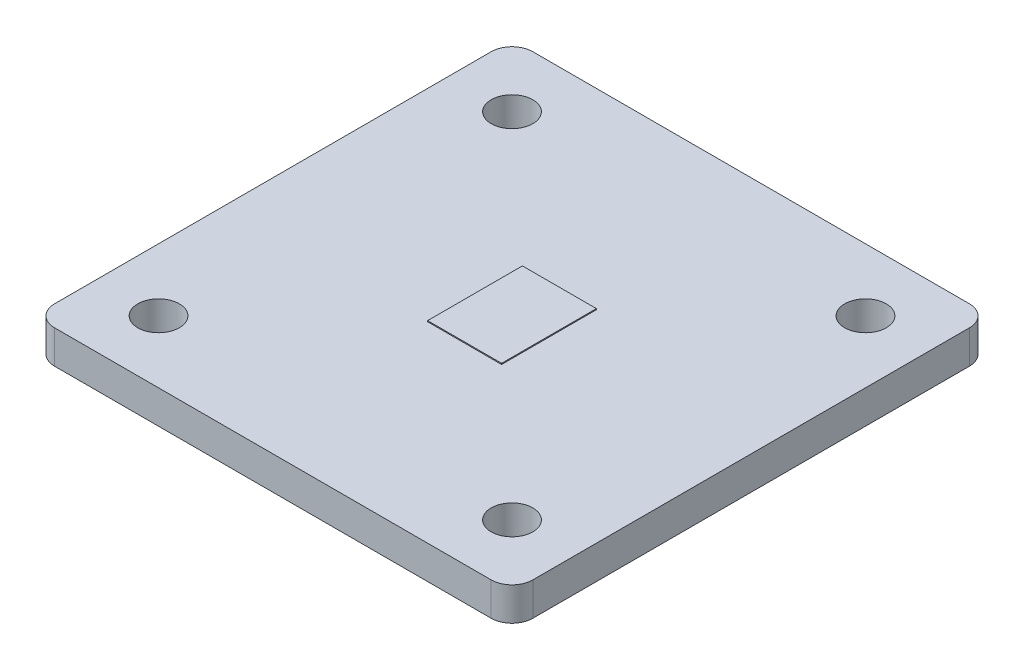
ISO-10303-21;
HEADER;
FILE_DESCRIPTION(('STEP AP214'),'2;1');
FILE_NAME('part.step','',(''),(''),'','','');
FILE_SCHEMA(('AUTOMOTIVE_DESIGN { 1 0 10303 214 1 1 1 1 }'));
ENDSEC;
DATA;
#1=APPLICATION_CONTEXT('core data for automotive mechanical design processes');
#2=APPLICATION_PROTOCOL_DEFINITION('international standard','automotive_design',2000,#1);
#3=PRODUCT_CONTEXT('',#1,'mechanical');
#4=PRODUCT('Part','Part','',(#3));
#5=PRODUCT_RELATED_PRODUCT_CATEGORY('part','',(#4));
#6=PRODUCT_DEFINITION_FORMATION('','',#4);
#7=PRODUCT_DEFINITION_CONTEXT('part definition',#1,'design');
#8=PRODUCT_DEFINITION('design','',#6,#7);
#9=PRODUCT_DEFINITION_SHAPE('','',#8);
#10=(LENGTH_UNIT() NAMED_UNIT(*) SI_UNIT(.MILLI.,.METRE.));
#11=(NAMED_UNIT(*) PLANE_ANGLE_UNIT() SI_UNIT($,.RADIAN.));
#12=(NAMED_UNIT(*) SI_UNIT($,.STERADIAN.) SOLID_ANGLE_UNIT());
#13=UNCERTAINTY_MEASURE_WITH_UNIT(LENGTH_MEASURE(1.E-05),#10,'distance_accuracy_value','');
#14=(GEOMETRIC_REPRESENTATION_CONTEXT(3) GLOBAL_UNCERTAINTY_ASSIGNED_CONTEXT((#13)) GLOBAL_UNIT_ASSIGNED_CONTEXT((#10,
#11,#12)) REPRESENTATION_CONTEXT('',''));
#15=CARTESIAN_POINT('',(0.,0.,0.));
#16=DIRECTION('',(0.,0.,1.));
#17=DIRECTION('',(1.,0.,0.));
#18=AXIS2_PLACEMENT_3D('',#15,#16,#17);
#19=CARTESIAN_POINT('',(10.5,1.6,10.5));
#20=DIRECTION('',(0.,1.,0.));
#21=DIRECTION('',(0.,0.,1.));
#22=AXIS2_PLACEMENT_3D('',#19,#20,#21);
#23=PLANE('',#22);
#24=CARTESIAN_POINT('',(-8.5,1.6,8.5));
#25=DIRECTION('',(0.,1.,0.));
#26=DIRECTION('',(0.,0.,-1.));
#27=AXIS2_PLACEMENT_3D('',#24,#25,#26);
#28=CIRCLE('',#27,1.00000000000001);
#29=CARTESIAN_POINT('',(-8.5,1.6,7.49999999999999));
#30=VERTEX_POINT('',#29);
#31=EDGE_CURVE('E237',#30,#30,#28,.T.);
#32=ORIENTED_EDGE('',*,*,#31,.F.);
#33=EDGE_LOOP('',(#32));
#34=FACE_BOUND('',#33,.T.);
#35=CARTESIAN_POINT('',(8.49999999999999,1.6,-8.5));
#36=DIRECTION('',(0.,1.,0.));
#37=DIRECTION('',(0.,0.,-1.));
#38=AXIS2_PLACEMENT_3D('',#35,#36,#37);
#39=CIRCLE('',#38,1.);
#40=CARTESIAN_POINT('',(8.49999999999999,1.6,-9.5));
#41=VERTEX_POINT('',#40);
#42=EDGE_CURVE('E245',#41,#41,#39,.T.);
#43=ORIENTED_EDGE('',*,*,#42,.F.);
#44=EDGE_LOOP('',(#43));
#45=FACE_BOUND('',#44,.T.);
#46=CARTESIAN_POINT('',(8.5,1.6,8.5));
#47=DIRECTION('',(0.,1.,0.));
#48=DIRECTION('',(0.,0.,1.));
#49=AXIS2_PLACEMENT_3D('',#46,#47,#48);
#50=CIRCLE('',#49,1.00000000000001);
#51=CARTESIAN_POINT('',(8.5,1.6,9.5));
#52=VERTEX_POINT('',#51);
#53=EDGE_CURVE('E246',#52,#52,#50,.T.);
#54=ORIENTED_EDGE('',*,*,#53,.F.);
#55=EDGE_LOOP('',(#54));
#56=FACE_BOUND('',#55,.T.);
#57=CARTESIAN_POINT('',(-8.5,1.6,-8.5));
#58=DIRECTION('',(0.,1.,0.));
#59=DIRECTION('',(0.,0.,1.));
#60=AXIS2_PLACEMENT_3D('',#57,#58,#59);
#61=CIRCLE('',#60,1.);
#62=CARTESIAN_POINT('',(-8.5,1.6,-7.5));
#63=VERTEX_POINT('',#62);
#64=EDGE_CURVE('E233',#63,#63,#61,.T.);
#65=ORIENTED_EDGE('',*,*,#64,.F.);
#66=EDGE_LOOP('',(#65));
#67=FACE_BOUND('',#66,.T.);
#68=CARTESIAN_POINT('',(10.5,1.6,10.5));
#69=DIRECTION('',(0.,1.,0.));
#70=DIRECTION('',(0.,0.,1.));
#71=AXIS2_PLACEMENT_3D('',#68,#69,#70);
#72=CIRCLE('',#71,0.999999999999999);
#73=CARTESIAN_POINT('',(10.5,1.6,11.5));
#74=VERTEX_POINT('',#73);
#75=CARTESIAN_POINT('',(11.5,1.6,10.5));
#76=VERTEX_POINT('',#75);
#77=EDGE_CURVE('E189',#74,#76,#72,.T.);
#78=ORIENTED_EDGE('',*,*,#77,.T.);
#79=DIRECTION('',(0.,0.,-1.));
#80=VECTOR('',#79,1.);
#81=CARTESIAN_POINT('',(11.5,1.6,10.5));
#82=LINE('',#81,#80);
#83=CARTESIAN_POINT('',(11.5,1.6,-10.5));
#84=VERTEX_POINT('',#83);
#85=EDGE_CURVE('E117',#76,#84,#82,.T.);
#86=ORIENTED_EDGE('',*,*,#85,.T.);
#87=CARTESIAN_POINT('',(10.5,1.6,-10.5));
#88=DIRECTION('',(0.,1.,0.));
#89=DIRECTION('',(0.,0.,-1.));
#90=AXIS2_PLACEMENT_3D('',#87,#88,#89);
#91=CIRCLE('',#90,0.999999999999999);
#92=CARTESIAN_POINT('',(10.5,1.6,-11.5));
#93=VERTEX_POINT('',#92);
#94=EDGE_CURVE('E210',#84,#93,#91,.T.);
#95=ORIENTED_EDGE('',*,*,#94,.T.);
#96=DIRECTION('',(-1.,0.,0.));
#97=VECTOR('',#96,1.);
#98=CARTESIAN_POINT('',(-10.5,1.6,-11.5));
#99=LINE('',#98,#97);
#100=CARTESIAN_POINT('',(-10.5,1.6,-11.5));
#101=VERTEX_POINT('',#100);
#102=EDGE_CURVE('E223',#93,#101,#99,.T.);
#103=ORIENTED_EDGE('',*,*,#102,.T.);
#104=CARTESIAN_POINT('',(-10.5,1.6,-10.5));
#105=DIRECTION('',(0.,1.,0.));
#106=DIRECTION('',(0.,0.,-1.));
#107=AXIS2_PLACEMENT_3D('',#104,#105,#106);
#108=CIRCLE('',#107,0.999999999999999);
#109=CARTESIAN_POINT('',(-11.5,1.6,-10.5));
#110=VERTEX_POINT('',#109);
#111=EDGE_CURVE('E140',#101,#110,#108,.T.);
#112=ORIENTED_EDGE('',*,*,#111,.T.);
#113=DIRECTION('',(0.,0.,1.));
#114=VECTOR('',#113,1.);
#115=CARTESIAN_POINT('',(-11.5,1.6,10.5));
#116=LINE('',#115,#114);
#117=CARTESIAN_POINT('',(-11.5,1.6,10.5));
#118=VERTEX_POINT('',#117);
#119=EDGE_CURVE('E133',#110,#118,#116,.T.);
#120=ORIENTED_EDGE('',*,*,#119,.T.);
#121=CARTESIAN_POINT('',(-10.5,1.6,10.5));
#122=DIRECTION('',(0.,1.,0.));
#123=DIRECTION('',(0.,0.,-1.));
#124=AXIS2_PLACEMENT_3D('',#121,#122,#123);
#125=CIRCLE('',#124,0.999999999999999);
#126=CARTESIAN_POINT('',(-10.5,1.6,11.5));
#127=VERTEX_POINT('',#126);
#128=EDGE_CURVE('E137',#118,#127,#125,.T.);
#129=ORIENTED_EDGE('',*,*,#128,.T.);
#130=DIRECTION('',(1.,0.,0.));
#131=VECTOR('',#130,1.);
#132=CARTESIAN_POINT('',(-10.5,1.6,11.5));
#133=LINE('',#132,#131);
#134=EDGE_CURVE('E76',#127,#74,#133,.T.);
#135=ORIENTED_EDGE('',*,*,#134,.T.);
#136=EDGE_LOOP('',(#78,#86,#95,#103,#112,#120,#129,#135));
#137=FACE_BOUND('',#136,.T.);
#138=DIRECTION('',(-1.,0.,0.));
#139=VECTOR('',#138,1.);
#140=CARTESIAN_POINT('',(-1.7785,1.6,-2.2785));
#141=LINE('',#140,#139);
#142=CARTESIAN_POINT('',(1.7785,1.6,-2.2785));
#143=VERTEX_POINT('',#142);
#144=CARTESIAN_POINT('',(-1.7785,1.6,-2.2785));
#145=VERTEX_POINT('',#144);
#146=EDGE_CURVE('E286',#143,#145,#141,.T.);
#147=ORIENTED_EDGE('',*,*,#146,.F.);
#148=DIRECTION('',(0.,0.,-1.));
#149=VECTOR('',#148,1.);
#150=CARTESIAN_POINT('',(1.7785,1.6,2.2785));
#151=LINE('',#150,#149);
#152=CARTESIAN_POINT('',(1.7785,1.6,2.2785));
#153=VERTEX_POINT('',#152);
#154=EDGE_CURVE('E290',#153,#143,#151,.T.);
#155=ORIENTED_EDGE('',*,*,#154,.F.);
#156=DIRECTION('',(1.,0.,0.));
#157=VECTOR('',#156,1.);
#158=CARTESIAN_POINT('',(-1.7785,1.6,2.2785));
#159=LINE('',#158,#157);
#160=CARTESIAN_POINT('',(-1.7785,1.6,2.2785));
#161=VERTEX_POINT('',#160);
#162=EDGE_CURVE('E279',#161,#153,#159,.T.);
#163=ORIENTED_EDGE('',*,*,#162,.F.);
#164=DIRECTION('',(0.,0.,1.));
#165=VECTOR('',#164,1.);
#166=CARTESIAN_POINT('',(-1.7785,1.6,2.2785));
#167=LINE('',#166,#165);
#168=EDGE_CURVE('E283',#145,#161,#167,.T.);
#169=ORIENTED_EDGE('',*,*,#168,.F.);
#170=EDGE_LOOP('',(#147,#155,#163,#169));
#171=FACE_BOUND('',#170,.T.);
#172=ADVANCED_FACE('F51',(#34,#45,#56,#67,#137,#171),#23,.T.);
#173=CARTESIAN_POINT('',(10.5,1.6,10.5));
#174=DIRECTION('',(0.,-1.,0.));
#175=DIRECTION('',(0.,0.,-1.));
#176=AXIS2_PLACEMENT_3D('',#173,#174,#175);
#177=CYLINDRICAL_SURFACE('',#176,0.999999999999999);
#178=CARTESIAN_POINT('',(10.5,0.,10.5));
#179=DIRECTION('',(0.,1.,0.));
#180=DIRECTION('',(0.,0.,1.));
#181=AXIS2_PLACEMENT_3D('',#178,#179,#180);
#182=CIRCLE('',#181,0.999999999999999);
#183=CARTESIAN_POINT('',(10.5,0.,11.5));
#184=VERTEX_POINT('',#183);
#185=CARTESIAN_POINT('',(11.5,0.,10.5));
#186=VERTEX_POINT('',#185);
#187=EDGE_CURVE('E165',#184,#186,#182,.T.);
#188=ORIENTED_EDGE('',*,*,#187,.T.);
#189=DIRECTION('',(0.,-1.,0.));
#190=VECTOR('',#189,1.);
#191=CARTESIAN_POINT('',(11.5,1.6,10.5));
#192=LINE('',#191,#190);
#193=EDGE_CURVE('E11',#76,#186,#192,.T.);
#194=ORIENTED_EDGE('',*,*,#193,.F.);
#195=ORIENTED_EDGE('',*,*,#77,.F.);
#196=DIRECTION('',(0.,-1.,0.));
#197=VECTOR('',#196,1.);
#198=CARTESIAN_POINT('',(10.5,1.6,11.5));
#199=LINE('',#198,#197);
#200=EDGE_CURVE('E161',#74,#184,#199,.T.);
#201=ORIENTED_EDGE('',*,*,#200,.T.);
#202=EDGE_LOOP('',(#188,#194,#195,#201));
#203=FACE_BOUND('',#202,.T.);
#204=ADVANCED_FACE('F53',(#203),#177,.T.);
#205=CARTESIAN_POINT('',(11.5,1.6,10.5));
#206=DIRECTION('',(-1.,0.,0.));
#207=DIRECTION('',(0.,0.,1.));
#208=AXIS2_PLACEMENT_3D('',#205,#206,#207);
#209=PLANE('',#208);
#210=DIRECTION('',(0.,0.,-1.));
#211=VECTOR('',#210,1.);
#212=CARTESIAN_POINT('',(11.5,0.,10.5));
#213=LINE('',#212,#211);
#214=CARTESIAN_POINT('',(11.5,0.,-10.5));
#215=VERTEX_POINT('',#214);
#216=EDGE_CURVE('E169',#186,#215,#213,.T.);
#217=ORIENTED_EDGE('',*,*,#216,.T.);
#218=DIRECTION('',(0.,-1.,0.));
#219=VECTOR('',#218,1.);
#220=CARTESIAN_POINT('',(11.5,1.6,-10.5));
#221=LINE('',#220,#219);
#222=EDGE_CURVE('E60',#84,#215,#221,.T.);
#223=ORIENTED_EDGE('',*,*,#222,.F.);
#224=ORIENTED_EDGE('',*,*,#85,.F.);
#225=ORIENTED_EDGE('',*,*,#193,.T.);
#226=EDGE_LOOP('',(#217,#223,#224,#225));
#227=FACE_BOUND('',#226,.T.);
#228=ADVANCED_FACE('F344',(#227),#209,.F.);
#229=CARTESIAN_POINT('',(10.5,1.6,-10.5));
#230=DIRECTION('',(0.,-1.,0.));
#231=DIRECTION('',(0.,0.,-1.));
#232=AXIS2_PLACEMENT_3D('',#229,#230,#231);
#233=CYLINDRICAL_SURFACE('',#232,0.999999999999999);
#234=CARTESIAN_POINT('',(10.5,0.,-10.5));
#235=DIRECTION('',(0.,1.,0.));
#236=DIRECTION('',(0.,0.,-1.));
#237=AXIS2_PLACEMENT_3D('',#234,#235,#236);
#238=CIRCLE('',#237,0.999999999999999);
#239=CARTESIAN_POINT('',(10.5,0.,-11.5));
#240=VERTEX_POINT('',#239);
#241=EDGE_CURVE('E173',#215,#240,#238,.T.);
#242=ORIENTED_EDGE('',*,*,#241,.T.);
#243=DIRECTION('',(0.,-1.,0.));
#244=VECTOR('',#243,1.);
#245=CARTESIAN_POINT('',(10.5,1.6,-11.5));
#246=LINE('',#245,#244);
#247=EDGE_CURVE('E200',#93,#240,#246,.T.);
#248=ORIENTED_EDGE('',*,*,#247,.F.);
#249=ORIENTED_EDGE('',*,*,#94,.F.);
#250=ORIENTED_EDGE('',*,*,#222,.T.);
#251=EDGE_LOOP('',(#242,#248,#249,#250));
#252=FACE_BOUND('',#251,.T.);
#253=ADVANCED_FACE('F208',(#252),#233,.T.);
#254=CARTESIAN_POINT('',(-10.5,1.6,-11.5));
#255=DIRECTION('',(0.,0.,1.));
#256=DIRECTION('',(1.,0.,0.));
#257=AXIS2_PLACEMENT_3D('',#254,#255,#256);
#258=PLANE('',#257);
#259=DIRECTION('',(-1.,0.,0.));
#260=VECTOR('',#259,1.);
#261=CARTESIAN_POINT('',(-10.5,0.,-11.5));
#262=LINE('',#261,#260);
#263=CARTESIAN_POINT('',(-10.5,0.,-11.5));
#264=VERTEX_POINT('',#263);
#265=EDGE_CURVE('E176',#240,#264,#262,.T.);
#266=ORIENTED_EDGE('',*,*,#265,.T.);
#267=DIRECTION('',(0.,-1.,0.));
#268=VECTOR('',#267,1.);
#269=CARTESIAN_POINT('',(-10.5,1.6,-11.5));
#270=LINE('',#269,#268);
#271=EDGE_CURVE('E196',#101,#264,#270,.T.);
#272=ORIENTED_EDGE('',*,*,#271,.F.);
#273=ORIENTED_EDGE('',*,*,#102,.F.);
#274=ORIENTED_EDGE('',*,*,#247,.T.);
#275=EDGE_LOOP('',(#266,#272,#273,#274));
#276=FACE_BOUND('',#275,.T.);
#277=ADVANCED_FACE('F218',(#276),#258,.F.);
#278=CARTESIAN_POINT('',(-10.5,1.6,-10.5));
#279=DIRECTION('',(0.,-1.,0.));
#280=DIRECTION('',(0.,0.,-1.));
#281=AXIS2_PLACEMENT_3D('',#278,#279,#280);
#282=CYLINDRICAL_SURFACE('',#281,0.999999999999999);
#283=CARTESIAN_POINT('',(-10.5,0.,-10.5));
#284=DIRECTION('',(0.,1.,0.));
#285=DIRECTION('',(0.,0.,-1.));
#286=AXIS2_PLACEMENT_3D('',#283,#284,#285);
#287=CIRCLE('',#286,0.999999999999999);
#288=CARTESIAN_POINT('',(-11.5,0.,-10.5));
#289=VERTEX_POINT('',#288);
#290=EDGE_CURVE('E179',#264,#289,#287,.T.);
#291=ORIENTED_EDGE('',*,*,#290,.T.);
#292=DIRECTION('',(0.,-1.,0.));
#293=VECTOR('',#292,1.);
#294=CARTESIAN_POINT('',(-11.5,1.6,-10.5));
#295=LINE('',#294,#293);
#296=EDGE_CURVE('E154',#110,#289,#295,.T.);
#297=ORIENTED_EDGE('',*,*,#296,.F.);
#298=ORIENTED_EDGE('',*,*,#111,.F.);
#299=ORIENTED_EDGE('',*,*,#271,.T.);
#300=EDGE_LOOP('',(#291,#297,#298,#299));
#301=FACE_BOUND('',#300,.T.);
#302=ADVANCED_FACE('F221',(#301),#282,.T.);
#303=CARTESIAN_POINT('',(-11.5,1.6,10.5));
#304=DIRECTION('',(1.,0.,0.));
#305=DIRECTION('',(0.,0.,-1.));
#306=AXIS2_PLACEMENT_3D('',#303,#304,#305);
#307=PLANE('',#306);
#308=DIRECTION('',(0.,0.,1.));
#309=VECTOR('',#308,1.);
#310=CARTESIAN_POINT('',(-11.5,0.,10.5));
#311=LINE('',#310,#309);
#312=CARTESIAN_POINT('',(-11.5,0.,10.5));
#313=VERTEX_POINT('',#312);
#314=EDGE_CURVE('E150',#289,#313,#311,.T.);
#315=ORIENTED_EDGE('',*,*,#314,.T.);
#316=DIRECTION('',(0.,-1.,0.));
#317=VECTOR('',#316,1.);
#318=CARTESIAN_POINT('',(-11.5,1.6,10.5));
#319=LINE('',#318,#317);
#320=EDGE_CURVE('E147',#118,#313,#319,.T.);
#321=ORIENTED_EDGE('',*,*,#320,.F.);
#322=ORIENTED_EDGE('',*,*,#119,.F.);
#323=ORIENTED_EDGE('',*,*,#296,.T.);
#324=EDGE_LOOP('',(#315,#321,#322,#323));
#325=FACE_BOUND('',#324,.T.);
#326=ADVANCED_FACE('F148',(#325),#307,.F.);
#327=CARTESIAN_POINT('',(-10.5,1.6,10.5));
#328=DIRECTION('',(0.,-1.,0.));
#329=DIRECTION('',(0.,0.,-1.));
#330=AXIS2_PLACEMENT_3D('',#327,#328,#329);
#331=CYLINDRICAL_SURFACE('',#330,0.999999999999999);
#332=CARTESIAN_POINT('',(-10.5,0.,10.5));
#333=DIRECTION('',(0.,1.,0.));
#334=DIRECTION('',(0.,0.,-1.));
#335=AXIS2_PLACEMENT_3D('',#332,#333,#334);
#336=CIRCLE('',#335,0.999999999999999);
#337=CARTESIAN_POINT('',(-10.5,0.,11.5));
#338=VERTEX_POINT('',#337);
#339=EDGE_CURVE('E184',#313,#338,#336,.T.);
#340=ORIENTED_EDGE('',*,*,#339,.T.);
#341=DIRECTION('',(0.,-1.,0.));
#342=VECTOR('',#341,1.);
#343=CARTESIAN_POINT('',(-10.5,1.6,11.5));
#344=LINE('',#343,#342);
#345=EDGE_CURVE('E155',#127,#338,#344,.T.);
#346=ORIENTED_EDGE('',*,*,#345,.F.);
#347=ORIENTED_EDGE('',*,*,#128,.F.);
#348=ORIENTED_EDGE('',*,*,#320,.T.);
#349=EDGE_LOOP('',(#340,#346,#347,#348));
#350=FACE_BOUND('',#349,.T.);
#351=ADVANCED_FACE('F157',(#350),#331,.T.);
#352=CARTESIAN_POINT('',(-10.5,1.6,11.5));
#353=DIRECTION('',(0.,0.,-1.));
#354=DIRECTION('',(-1.,0.,0.));
#355=AXIS2_PLACEMENT_3D('',#352,#353,#354);
#356=PLANE('',#355);
#357=DIRECTION('',(1.,0.,0.));
#358=VECTOR('',#357,1.);
#359=CARTESIAN_POINT('',(-10.5,0.,11.5));
#360=LINE('',#359,#358);
#361=EDGE_CURVE('E109',#338,#184,#360,.T.);
#362=ORIENTED_EDGE('',*,*,#361,.T.);
#363=ORIENTED_EDGE('',*,*,#200,.F.);
#364=ORIENTED_EDGE('',*,*,#134,.F.);
#365=ORIENTED_EDGE('',*,*,#345,.T.);
#366=EDGE_LOOP('',(#362,#363,#364,#365));
#367=FACE_BOUND('',#366,.T.);
#368=ADVANCED_FACE('F354',(#367),#356,.F.);
#369=CARTESIAN_POINT('',(10.5,0.,10.5));
#370=DIRECTION('',(0.,1.,0.));
#371=DIRECTION('',(0.,0.,1.));
#372=AXIS2_PLACEMENT_3D('',#369,#370,#371);
#373=PLANE('',#372);
#374=CARTESIAN_POINT('',(-8.5,0.,8.5));
#375=DIRECTION('',(0.,1.,0.));
#376=DIRECTION('',(0.,0.,-1.));
#377=AXIS2_PLACEMENT_3D('',#374,#375,#376);
#378=CIRCLE('',#377,1.00000000000001);
#379=CARTESIAN_POINT('',(-8.5,0.,7.49999999999999));
#380=VERTEX_POINT('',#379);
#381=EDGE_CURVE('E250',#380,#380,#378,.T.);
#382=ORIENTED_EDGE('',*,*,#381,.T.);
#383=EDGE_LOOP('',(#382));
#384=FACE_BOUND('',#383,.T.);
#385=CARTESIAN_POINT('',(8.49999999999999,0.,-8.5));
#386=DIRECTION('',(0.,1.,0.));
#387=DIRECTION('',(0.,0.,-1.));
#388=AXIS2_PLACEMENT_3D('',#385,#386,#387);
#389=CIRCLE('',#388,1.);
#390=CARTESIAN_POINT('',(8.49999999999999,0.,-9.5));
#391=VERTEX_POINT('',#390);
#392=EDGE_CURVE('E241',#391,#391,#389,.T.);
#393=ORIENTED_EDGE('',*,*,#392,.T.);
#394=EDGE_LOOP('',(#393));
#395=FACE_BOUND('',#394,.T.);
#396=CARTESIAN_POINT('',(8.5,0.,8.5));
#397=DIRECTION('',(0.,1.,0.));
#398=DIRECTION('',(0.,0.,1.));
#399=AXIS2_PLACEMENT_3D('',#396,#397,#398);
#400=CIRCLE('',#399,1.00000000000001);
#401=CARTESIAN_POINT('',(8.5,0.,9.5));
#402=VERTEX_POINT('',#401);
#403=EDGE_CURVE('E257',#402,#402,#400,.T.);
#404=ORIENTED_EDGE('',*,*,#403,.T.);
#405=EDGE_LOOP('',(#404));
#406=FACE_BOUND('',#405,.T.);
#407=CARTESIAN_POINT('',(-8.5,0.,-8.5));
#408=DIRECTION('',(0.,1.,0.));
#409=DIRECTION('',(0.,0.,1.));
#410=AXIS2_PLACEMENT_3D('',#407,#408,#409);
#411=CIRCLE('',#410,1.);
#412=CARTESIAN_POINT('',(-8.5,0.,-7.5));
#413=VERTEX_POINT('',#412);
#414=EDGE_CURVE('E170',#413,#413,#411,.T.);
#415=ORIENTED_EDGE('',*,*,#414,.T.);
#416=EDGE_LOOP('',(#415));
#417=FACE_BOUND('',#416,.T.);
#418=ORIENTED_EDGE('',*,*,#187,.F.);
#419=ORIENTED_EDGE('',*,*,#361,.F.);
#420=ORIENTED_EDGE('',*,*,#339,.F.);
#421=ORIENTED_EDGE('',*,*,#314,.F.);
#422=ORIENTED_EDGE('',*,*,#290,.F.);
#423=ORIENTED_EDGE('',*,*,#265,.F.);
#424=ORIENTED_EDGE('',*,*,#241,.F.);
#425=ORIENTED_EDGE('',*,*,#216,.F.);
#426=EDGE_LOOP('',(#418,#419,#420,#421,#422,#423,#424,#425));
#427=FACE_BOUND('',#426,.T.);
#428=ADVANCED_FACE('F214',(#384,#395,#406,#417,#427),#373,.F.);
#429=CARTESIAN_POINT('',(-8.5,0.,-8.5));
#430=DIRECTION('',(0.,1.,0.));
#431=DIRECTION('',(0.,0.,1.));
#432=AXIS2_PLACEMENT_3D('',#429,#430,#431);
#433=CYLINDRICAL_SURFACE('',#432,1.);
#434=ORIENTED_EDGE('',*,*,#414,.F.);
#435=EDGE_LOOP('',(#434));
#436=FACE_BOUND('',#435,.T.);
#437=ORIENTED_EDGE('',*,*,#64,.T.);
#438=EDGE_LOOP('',(#437));
#439=FACE_BOUND('',#438,.T.);
#440=ADVANCED_FACE('F350',(#436,#439),#433,.F.);
#441=CARTESIAN_POINT('',(8.5,0.,8.5));
#442=DIRECTION('',(0.,1.,0.));
#443=DIRECTION('',(0.,0.,1.));
#444=AXIS2_PLACEMENT_3D('',#441,#442,#443);
#445=CYLINDRICAL_SURFACE('',#444,1.00000000000001);
#446=ORIENTED_EDGE('',*,*,#403,.F.);
#447=EDGE_LOOP('',(#446));
#448=FACE_BOUND('',#447,.T.);
#449=ORIENTED_EDGE('',*,*,#53,.T.);
#450=EDGE_LOOP('',(#449));
#451=FACE_BOUND('',#450,.T.);
#452=ADVANCED_FACE('F404',(#448,#451),#445,.F.);
#453=CARTESIAN_POINT('',(8.49999999999999,0.,-8.5));
#454=DIRECTION('',(0.,1.,0.));
#455=DIRECTION('',(0.,0.,1.));
#456=AXIS2_PLACEMENT_3D('',#453,#454,#455);
#457=CYLINDRICAL_SURFACE('',#456,1.);
#458=ORIENTED_EDGE('',*,*,#392,.F.);
#459=EDGE_LOOP('',(#458));
#460=FACE_BOUND('',#459,.T.);
#461=ORIENTED_EDGE('',*,*,#42,.T.);
#462=EDGE_LOOP('',(#461));
#463=FACE_BOUND('',#462,.T.);
#464=ADVANCED_FACE('F411',(#460,#463),#457,.F.);
#465=CARTESIAN_POINT('',(-8.5,0.,8.5));
#466=DIRECTION('',(0.,1.,0.));
#467=DIRECTION('',(0.,0.,1.));
#468=AXIS2_PLACEMENT_3D('',#465,#466,#467);
#469=CYLINDRICAL_SURFACE('',#468,1.00000000000001);
#470=ORIENTED_EDGE('',*,*,#381,.F.);
#471=EDGE_LOOP('',(#470));
#472=FACE_BOUND('',#471,.T.);
#473=ORIENTED_EDGE('',*,*,#31,.T.);
#474=EDGE_LOOP('',(#473));
#475=FACE_BOUND('',#474,.T.);
#476=ADVANCED_FACE('F419',(#472,#475),#469,.F.);
#477=CARTESIAN_POINT('',(1.7785,1.65,2.2785));
#478=DIRECTION('',(-1.,0.,0.));
#479=DIRECTION('',(0.,0.,1.));
#480=AXIS2_PLACEMENT_3D('',#477,#478,#479);
#481=PLANE('',#480);
#482=ORIENTED_EDGE('',*,*,#154,.T.);
#483=DIRECTION('',(0.,-1.,0.));
#484=VECTOR('',#483,1.);
#485=CARTESIAN_POINT('',(1.7785,1.65,-2.2785));
#486=LINE('',#485,#484);
#487=CARTESIAN_POINT('',(1.7785,1.65,-2.2785));
#488=VERTEX_POINT('',#487);
#489=EDGE_CURVE('E261',#488,#143,#486,.T.);
#490=ORIENTED_EDGE('',*,*,#489,.F.);
#491=DIRECTION('',(0.,0.,-1.));
#492=VECTOR('',#491,1.);
#493=CARTESIAN_POINT('',(1.7785,1.65,2.2785));
#494=LINE('',#493,#492);
#495=CARTESIAN_POINT('',(1.7785,1.65,2.2785));
#496=VERTEX_POINT('',#495);
#497=EDGE_CURVE('E282',#496,#488,#494,.T.);
#498=ORIENTED_EDGE('',*,*,#497,.F.);
#499=DIRECTION('',(0.,-1.,0.));
#500=VECTOR('',#499,1.);
#501=CARTESIAN_POINT('',(1.7785,1.65,2.2785));
#502=LINE('',#501,#500);
#503=EDGE_CURVE('E274',#496,#153,#502,.T.);
#504=ORIENTED_EDGE('',*,*,#503,.T.);
#505=EDGE_LOOP('',(#482,#490,#498,#504));
#506=FACE_BOUND('',#505,.T.);
#507=ADVANCED_FACE('F318',(#506),#481,.F.);
#508=CARTESIAN_POINT('',(-1.7785,1.65,-2.2785));
#509=DIRECTION('',(0.,0.,1.));
#510=DIRECTION('',(1.,0.,0.));
#511=AXIS2_PLACEMENT_3D('',#508,#509,#510);
#512=PLANE('',#511);
#513=ORIENTED_EDGE('',*,*,#146,.T.);
#514=DIRECTION('',(0.,-1.,0.));
#515=VECTOR('',#514,1.);
#516=CARTESIAN_POINT('',(-1.7785,1.65,-2.2785));
#517=LINE('',#516,#515);
#518=CARTESIAN_POINT('',(-1.7785,1.65,-2.2785));
#519=VERTEX_POINT('',#518);
#520=EDGE_CURVE('E268',#519,#145,#517,.T.);
#521=ORIENTED_EDGE('',*,*,#520,.F.);
#522=DIRECTION('',(-1.,0.,0.));
#523=VECTOR('',#522,1.);
#524=CARTESIAN_POINT('',(-1.7785,1.65,-2.2785));
#525=LINE('',#524,#523);
#526=EDGE_CURVE('E301',#488,#519,#525,.T.);
#527=ORIENTED_EDGE('',*,*,#526,.F.);
#528=ORIENTED_EDGE('',*,*,#489,.T.);
#529=EDGE_LOOP('',(#513,#521,#527,#528));
#530=FACE_BOUND('',#529,.T.);
#531=ADVANCED_FACE('F323',(#530),#512,.F.);
#532=CARTESIAN_POINT('',(-1.7785,1.65,2.2785));
#533=DIRECTION('',(1.,0.,0.));
#534=DIRECTION('',(0.,0.,-1.));
#535=AXIS2_PLACEMENT_3D('',#532,#533,#534);
#536=PLANE('',#535);
#537=ORIENTED_EDGE('',*,*,#168,.T.);
#538=DIRECTION('',(0.,-1.,0.));
#539=VECTOR('',#538,1.);
#540=CARTESIAN_POINT('',(-1.7785,1.65,2.2785));
#541=LINE('',#540,#539);
#542=CARTESIAN_POINT('',(-1.7785,1.65,2.2785));
#543=VERTEX_POINT('',#542);
#544=EDGE_CURVE('E67',#543,#161,#541,.T.);
#545=ORIENTED_EDGE('',*,*,#544,.F.);
#546=DIRECTION('',(0.,0.,1.));
#547=VECTOR('',#546,1.);
#548=CARTESIAN_POINT('',(-1.7785,1.65,2.2785));
#549=LINE('',#548,#547);
#550=EDGE_CURVE('E297',#519,#543,#549,.T.);
#551=ORIENTED_EDGE('',*,*,#550,.F.);
#552=ORIENTED_EDGE('',*,*,#520,.T.);
#553=EDGE_LOOP('',(#537,#545,#551,#552));
#554=FACE_BOUND('',#553,.T.);
#555=ADVANCED_FACE('F332',(#554),#536,.F.);
#556=CARTESIAN_POINT('',(-1.7785,1.65,2.2785));
#557=DIRECTION('',(0.,0.,-1.));
#558=DIRECTION('',(-1.,0.,0.));
#559=AXIS2_PLACEMENT_3D('',#556,#557,#558);
#560=PLANE('',#559);
#561=ORIENTED_EDGE('',*,*,#162,.T.);
#562=ORIENTED_EDGE('',*,*,#503,.F.);
#563=DIRECTION('',(1.,0.,0.));
#564=VECTOR('',#563,1.);
#565=CARTESIAN_POINT('',(-1.7785,1.65,2.2785));
#566=LINE('',#565,#564);
#567=EDGE_CURVE('E278',#543,#496,#566,.T.);
#568=ORIENTED_EDGE('',*,*,#567,.F.);
#569=ORIENTED_EDGE('',*,*,#544,.T.);
#570=EDGE_LOOP('',(#561,#562,#568,#569));
#571=FACE_BOUND('',#570,.T.);
#572=ADVANCED_FACE('F335',(#571),#560,.F.);
#573=CARTESIAN_POINT('',(0.,1.65,0.));
#574=DIRECTION('',(0.,-1.,0.));
#575=DIRECTION('',(0.,0.,-1.));
#576=AXIS2_PLACEMENT_3D('',#573,#574,#575);
#577=PLANE('',#576);
#578=ORIENTED_EDGE('',*,*,#497,.T.);
#579=ORIENTED_EDGE('',*,*,#526,.T.);
#580=ORIENTED_EDGE('',*,*,#550,.T.);
#581=ORIENTED_EDGE('',*,*,#567,.T.);
#582=EDGE_LOOP('',(#578,#579,#580,#581));
#583=FACE_BOUND('',#582,.T.);
#584=ADVANCED_FACE('F311',(#583),#577,.F.);
#585=CLOSED_SHELL('',(#172,#204,#228,#253,#277,#302,#326,#351,#368,#428,#440,#452,#464,#476,
#507,#531,#555,#572,#584));
#586=MANIFOLD_SOLID_BREP('B2',#585);
#587=ADVANCED_BREP_SHAPE_REPRESENTATION('',(#18,#586),#14);
#588=SHAPE_DEFINITION_REPRESENTATION(#9,#587);
ENDSEC;
END-ISO-10303-21;
